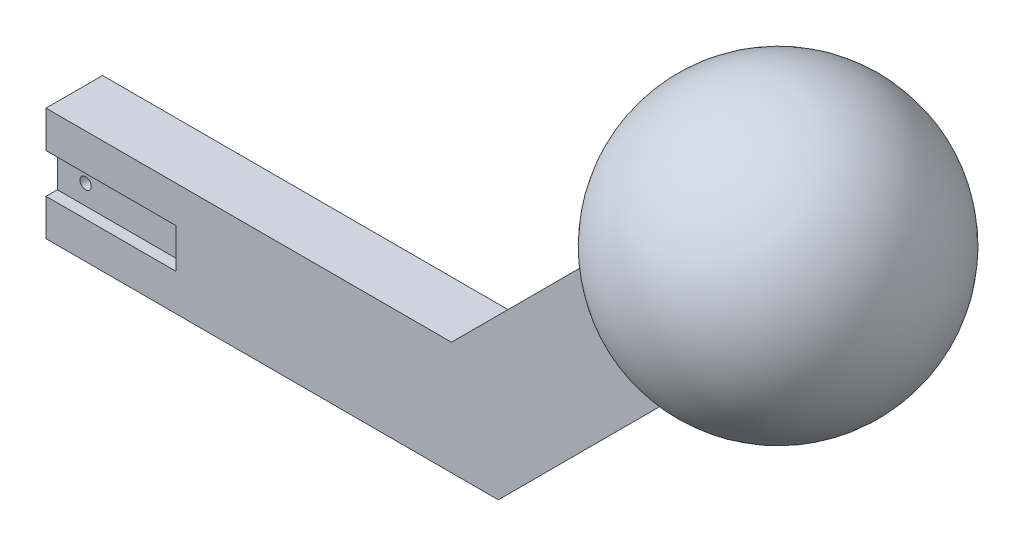
ISO-10303-21;
HEADER;
FILE_DESCRIPTION(('STEP AP214'),'2;1');
FILE_NAME('part.step','',(''),(''),'','','');
FILE_SCHEMA(('AUTOMOTIVE_DESIGN { 1 0 10303 214 1 1 1 1 }'));
ENDSEC;
DATA;
#1=APPLICATION_CONTEXT('core data for automotive mechanical design processes');
#2=APPLICATION_PROTOCOL_DEFINITION('international standard','automotive_design',2000,#1);
#3=PRODUCT_CONTEXT('',#1,'mechanical');
#4=PRODUCT('Part','Part','',(#3));
#5=PRODUCT_RELATED_PRODUCT_CATEGORY('part','',(#4));
#6=PRODUCT_DEFINITION_FORMATION('','',#4);
#7=PRODUCT_DEFINITION_CONTEXT('part definition',#1,'design');
#8=PRODUCT_DEFINITION('design','',#6,#7);
#9=PRODUCT_DEFINITION_SHAPE('','',#8);
#10=(LENGTH_UNIT() NAMED_UNIT(*) SI_UNIT(.MILLI.,.METRE.));
#11=(NAMED_UNIT(*) PLANE_ANGLE_UNIT() SI_UNIT($,.RADIAN.));
#12=(NAMED_UNIT(*) SI_UNIT($,.STERADIAN.) SOLID_ANGLE_UNIT());
#13=UNCERTAINTY_MEASURE_WITH_UNIT(LENGTH_MEASURE(1.E-05),#10,'distance_accuracy_value','');
#14=(GEOMETRIC_REPRESENTATION_CONTEXT(3) GLOBAL_UNCERTAINTY_ASSIGNED_CONTEXT((#13)) GLOBAL_UNIT_ASSIGNED_CONTEXT((#10,
#11,#12)) REPRESENTATION_CONTEXT('',''));
#15=CARTESIAN_POINT('',(0.,0.,0.));
#16=DIRECTION('',(0.,0.,1.));
#17=DIRECTION('',(1.,0.,0.));
#18=AXIS2_PLACEMENT_3D('',#15,#16,#17);
#19=CARTESIAN_POINT('',(5.,10.,10.));
#20=DIRECTION('',(0.,0.,-1.));
#21=DIRECTION('',(-1.,0.,0.));
#22=AXIS2_PLACEMENT_3D('',#19,#20,#21);
#23=CYLINDRICAL_SURFACE('',#22,1.);
#24=CARTESIAN_POINT('',(5.,10.,0.));
#25=DIRECTION('',(0.,0.,1.));
#26=DIRECTION('',(1.,0.,0.));
#27=AXIS2_PLACEMENT_3D('',#24,#25,#26);
#28=CIRCLE('',#27,1.);
#29=CARTESIAN_POINT('',(6.,10.,0.));
#30=VERTEX_POINT('',#29);
#31=EDGE_CURVE('E169',#30,#30,#28,.T.);
#32=ORIENTED_EDGE('',*,*,#31,.F.);
#33=EDGE_LOOP('',(#32));
#34=FACE_BOUND('',#33,.T.);
#35=CARTESIAN_POINT('',(5.,10.,8.));
#36=DIRECTION('',(0.,0.,1.));
#37=DIRECTION('',(1.,0.,0.));
#38=AXIS2_PLACEMENT_3D('',#35,#36,#37);
#39=CIRCLE('',#38,1.);
#40=CARTESIAN_POINT('',(6.,10.,8.));
#41=VERTEX_POINT('',#40);
#42=EDGE_CURVE('E41',#41,#41,#39,.T.);
#43=ORIENTED_EDGE('',*,*,#42,.T.);
#44=EDGE_LOOP('',(#43));
#45=FACE_BOUND('',#44,.T.);
#46=ADVANCED_FACE('F37',(#34,#45),#23,.F.);
#47=CARTESIAN_POINT('',(115.355339059327,35.3553390593274,10.));
#48=DIRECTION('',(-0.707106781186546,-0.707106781186549,0.));
#49=DIRECTION('',(0.707106781186549,-0.707106781186546,0.));
#50=AXIS2_PLACEMENT_3D('',#47,#48,#49);
#51=PLANE('',#50);
#52=DIRECTION('',(-0.707106781186549,0.707106781186546,0.));
#53=VECTOR('',#52,1.);
#54=CARTESIAN_POINT('',(115.355339059327,35.3553390593274,10.));
#55=LINE('',#54,#53);
#56=CARTESIAN_POINT('',(102.160546890504,48.5501312281508,10.));
#57=VERTEX_POINT('',#56);
#58=CARTESIAN_POINT('',(101.213203435596,49.4974746830584,10.));
#59=VERTEX_POINT('',#58);
#60=EDGE_CURVE('E180',#57,#59,#55,.T.);
#61=ORIENTED_EDGE('',*,*,#60,.F.);
#62=CARTESIAN_POINT('',(108.284271247462,42.4264068711929,5.));
#63=DIRECTION('',(-0.707106781186546,-0.707106781186549,0.));
#64=DIRECTION('',(0.707106781186549,-0.707106781186546,0.));
#65=AXIS2_PLACEMENT_3D('',#62,#63,#64);
#66=CIRCLE('',#65,10.);
#67=CARTESIAN_POINT('',(101.213203435596,49.4974746830584,5.));
#68=VERTEX_POINT('',#67);
#69=EDGE_CURVE('E263',#57,#68,#66,.T.);
#70=ORIENTED_EDGE('',*,*,#69,.T.);
#71=DIRECTION('',(0.,0.,-1.));
#72=VECTOR('',#71,1.);
#73=CARTESIAN_POINT('',(101.213203435596,49.4974746830584,10.));
#74=LINE('',#73,#72);
#75=EDGE_CURVE('E210',#59,#68,#74,.T.);
#76=ORIENTED_EDGE('',*,*,#75,.F.);
#77=EDGE_LOOP('',(#61,#70,#76));
#78=FACE_BOUND('',#77,.T.);
#79=ADVANCED_FACE('F285',(#78),#51,.F.);
#80=CARTESIAN_POINT('',(101.213203435596,49.4974746830584,0.));
#81=VERTEX_POINT('',#80);
#82=EDGE_CURVE('E209',#68,#81,#74,.T.);
#83=ORIENTED_EDGE('',*,*,#82,.F.);
#84=CARTESIAN_POINT('',(102.160546890504,48.5501312281508,0.));
#85=VERTEX_POINT('',#84);
#86=EDGE_CURVE('E260',#68,#85,#66,.T.);
#87=ORIENTED_EDGE('',*,*,#86,.T.);
#88=DIRECTION('',(-0.707106781186549,0.707106781186546,0.));
#89=VECTOR('',#88,1.);
#90=CARTESIAN_POINT('',(115.355339059327,35.3553390593274,0.));
#91=LINE('',#90,#89);
#92=EDGE_CURVE('E196',#85,#81,#91,.T.);
#93=ORIENTED_EDGE('',*,*,#92,.T.);
#94=EDGE_LOOP('',(#83,#87,#93));
#95=FACE_BOUND('',#94,.T.);
#96=ADVANCED_FACE('F259',(#95),#51,.F.);
#97=DIRECTION('',(0.,0.,-1.));
#98=VECTOR('',#97,1.);
#99=CARTESIAN_POINT('',(115.355339059327,35.3553390593274,10.));
#100=LINE('',#99,#98);
#101=CARTESIAN_POINT('',(115.355339059327,35.3553390593274,10.));
#102=VERTEX_POINT('',#101);
#103=CARTESIAN_POINT('',(115.355339059327,35.3553390593274,5.));
#104=VERTEX_POINT('',#103);
#105=EDGE_CURVE('E214',#102,#104,#100,.T.);
#106=ORIENTED_EDGE('',*,*,#105,.T.);
#107=CARTESIAN_POINT('',(114.40799560442,36.302682514235,10.));
#108=VERTEX_POINT('',#107);
#109=EDGE_CURVE('E61',#104,#108,#66,.T.);
#110=ORIENTED_EDGE('',*,*,#109,.T.);
#111=EDGE_CURVE('E181',#102,#108,#55,.T.);
#112=ORIENTED_EDGE('',*,*,#111,.F.);
#113=EDGE_LOOP('',(#106,#110,#112));
#114=FACE_BOUND('',#113,.T.);
#115=ADVANCED_FACE('F237',(#114),#51,.F.);
#116=CARTESIAN_POINT('',(0.,0.,10.));
#117=DIRECTION('',(0.,0.,1.));
#118=DIRECTION('',(1.,0.,0.));
#119=AXIS2_PLACEMENT_3D('',#116,#117,#118);
#120=PLANE('',#119);
#121=DIRECTION('',(-1.,0.,0.));
#122=VECTOR('',#121,1.);
#123=CARTESIAN_POINT('',(23.,13.5,10.));
#124=LINE('',#123,#122);
#125=CARTESIAN_POINT('',(23.,13.5,10.));
#126=VERTEX_POINT('',#125);
#127=CARTESIAN_POINT('',(0.,13.5,10.));
#128=VERTEX_POINT('',#127);
#129=EDGE_CURVE('E150',#126,#128,#124,.T.);
#130=ORIENTED_EDGE('',*,*,#129,.F.);
#131=DIRECTION('',(0.,1.,0.));
#132=VECTOR('',#131,1.);
#133=CARTESIAN_POINT('',(23.,6.5,10.));
#134=LINE('',#133,#132);
#135=CARTESIAN_POINT('',(23.,6.5,10.));
#136=VERTEX_POINT('',#135);
#137=EDGE_CURVE('E274',#136,#126,#134,.T.);
#138=ORIENTED_EDGE('',*,*,#137,.F.);
#139=DIRECTION('',(1.,0.,0.));
#140=VECTOR('',#139,1.);
#141=CARTESIAN_POINT('',(0.,6.5,10.));
#142=LINE('',#141,#140);
#143=CARTESIAN_POINT('',(0.,6.5,10.));
#144=VERTEX_POINT('',#143);
#145=EDGE_CURVE('E277',#144,#136,#142,.T.);
#146=ORIENTED_EDGE('',*,*,#145,.F.);
#147=DIRECTION('',(0.,-1.,0.));
#148=VECTOR('',#147,1.);
#149=CARTESIAN_POINT('',(0.,20.,10.));
#150=LINE('',#149,#148);
#151=CARTESIAN_POINT('',(0.,0.,10.));
#152=VERTEX_POINT('',#151);
#153=EDGE_CURVE('E154',#144,#152,#150,.T.);
#154=ORIENTED_EDGE('',*,*,#153,.T.);
#155=DIRECTION('',(1.,0.,0.));
#156=VECTOR('',#155,1.);
#157=CARTESIAN_POINT('',(0.,0.,10.));
#158=LINE('',#157,#156);
#159=CARTESIAN_POINT('',(80.,0.,10.));
#160=VERTEX_POINT('',#159);
#161=EDGE_CURVE('E176',#152,#160,#158,.T.);
#162=ORIENTED_EDGE('',*,*,#161,.T.);
#163=DIRECTION('',(0.707106781186546,0.707106781186549,0.));
#164=VECTOR('',#163,1.);
#165=CARTESIAN_POINT('',(80.,0.,10.));
#166=LINE('',#165,#164);
#167=EDGE_CURVE('E178',#160,#102,#166,.T.);
#168=ORIENTED_EDGE('',*,*,#167,.T.);
#169=ORIENTED_EDGE('',*,*,#111,.T.);
#170=DIRECTION('',(0.707106781186549,-0.707106781186546,0.));
#171=VECTOR('',#170,1.);
#172=CARTESIAN_POINT('',(75.3553390593271,75.3553390593275,10.));
#173=LINE('',#172,#171);
#174=EDGE_CURVE('E167',#57,#108,#173,.T.);
#175=ORIENTED_EDGE('',*,*,#174,.F.);
#176=ORIENTED_EDGE('',*,*,#60,.T.);
#177=DIRECTION('',(-0.707106781186546,-0.707106781186549,0.));
#178=VECTOR('',#177,1.);
#179=CARTESIAN_POINT('',(101.213203435596,49.4974746830584,10.));
#180=LINE('',#179,#178);
#181=CARTESIAN_POINT('',(71.7157287525381,20.,10.));
#182=VERTEX_POINT('',#181);
#183=EDGE_CURVE('E184',#59,#182,#180,.T.);
#184=ORIENTED_EDGE('',*,*,#183,.T.);
#185=DIRECTION('',(-1.,0.,0.));
#186=VECTOR('',#185,1.);
#187=CARTESIAN_POINT('',(71.7157287525381,20.,10.));
#188=LINE('',#187,#186);
#189=CARTESIAN_POINT('',(0.,20.,10.));
#190=VERTEX_POINT('',#189);
#191=EDGE_CURVE('E186',#182,#190,#188,.T.);
#192=ORIENTED_EDGE('',*,*,#191,.T.);
#193=EDGE_CURVE('E173',#190,#128,#150,.T.);
#194=ORIENTED_EDGE('',*,*,#193,.T.);
#195=EDGE_LOOP('',(#130,#138,#146,#154,#162,#168,#169,#175,#176,#184,#192,#194));
#196=FACE_BOUND('',#195,.T.);
#197=ADVANCED_FACE('F241',(#196),#120,.T.);
#198=CARTESIAN_POINT('',(0.,0.,0.));
#199=DIRECTION('',(0.,0.,1.));
#200=DIRECTION('',(1.,0.,0.));
#201=AXIS2_PLACEMENT_3D('',#198,#199,#200);
#202=PLANE('',#201);
#203=DIRECTION('',(0.,-1.,0.));
#204=VECTOR('',#203,1.);
#205=CARTESIAN_POINT('',(0.,20.,0.));
#206=LINE('',#205,#204);
#207=CARTESIAN_POINT('',(0.,20.,0.));
#208=VERTEX_POINT('',#207);
#209=CARTESIAN_POINT('',(0.,0.,0.));
#210=VERTEX_POINT('',#209);
#211=EDGE_CURVE('E172',#208,#210,#206,.T.);
#212=ORIENTED_EDGE('',*,*,#211,.F.);
#213=DIRECTION('',(-1.,0.,0.));
#214=VECTOR('',#213,1.);
#215=CARTESIAN_POINT('',(71.7157287525381,20.,0.));
#216=LINE('',#215,#214);
#217=CARTESIAN_POINT('',(71.7157287525381,20.,0.));
#218=VERTEX_POINT('',#217);
#219=EDGE_CURVE('E202',#218,#208,#216,.T.);
#220=ORIENTED_EDGE('',*,*,#219,.F.);
#221=DIRECTION('',(-0.707106781186546,-0.707106781186549,0.));
#222=VECTOR('',#221,1.);
#223=CARTESIAN_POINT('',(101.213203435596,49.4974746830584,0.));
#224=LINE('',#223,#222);
#225=EDGE_CURVE('E200',#81,#218,#224,.T.);
#226=ORIENTED_EDGE('',*,*,#225,.F.);
#227=ORIENTED_EDGE('',*,*,#92,.F.);
#228=DIRECTION('',(0.707106781186549,-0.707106781186546,0.));
#229=VECTOR('',#228,1.);
#230=CARTESIAN_POINT('',(75.3553390593271,75.3553390593275,0.));
#231=LINE('',#230,#229);
#232=CARTESIAN_POINT('',(114.40799560442,36.302682514235,0.));
#233=VERTEX_POINT('',#232);
#234=EDGE_CURVE('E162',#85,#233,#231,.T.);
#235=ORIENTED_EDGE('',*,*,#234,.T.);
#236=CARTESIAN_POINT('',(115.355339059327,35.3553390593274,0.));
#237=VERTEX_POINT('',#236);
#238=EDGE_CURVE('E197',#237,#233,#91,.T.);
#239=ORIENTED_EDGE('',*,*,#238,.F.);
#240=DIRECTION('',(0.707106781186546,0.707106781186549,0.));
#241=VECTOR('',#240,1.);
#242=CARTESIAN_POINT('',(80.,0.,0.));
#243=LINE('',#242,#241);
#244=CARTESIAN_POINT('',(80.,0.,0.));
#245=VERTEX_POINT('',#244);
#246=EDGE_CURVE('E193',#245,#237,#243,.T.);
#247=ORIENTED_EDGE('',*,*,#246,.F.);
#248=DIRECTION('',(1.,0.,0.));
#249=VECTOR('',#248,1.);
#250=CARTESIAN_POINT('',(0.,0.,0.));
#251=LINE('',#250,#249);
#252=EDGE_CURVE('E191',#210,#245,#251,.T.);
#253=ORIENTED_EDGE('',*,*,#252,.F.);
#254=EDGE_LOOP('',(#212,#220,#226,#227,#235,#239,#247,#253));
#255=FACE_BOUND('',#254,.T.);
#256=ORIENTED_EDGE('',*,*,#31,.T.);
#257=EDGE_LOOP('',(#256));
#258=FACE_BOUND('',#257,.T.);
#259=ADVANCED_FACE('F230',(#255,#258),#202,.F.);
#260=CARTESIAN_POINT('',(0.,20.,10.));
#261=DIRECTION('',(1.,0.,0.));
#262=DIRECTION('',(0.,1.,0.));
#263=AXIS2_PLACEMENT_3D('',#260,#261,#262);
#264=PLANE('',#263);
#265=DIRECTION('',(0.,-1.,0.));
#266=VECTOR('',#265,1.);
#267=CARTESIAN_POINT('',(0.,13.5,8.));
#268=LINE('',#267,#266);
#269=CARTESIAN_POINT('',(0.,13.5,8.));
#270=VERTEX_POINT('',#269);
#271=CARTESIAN_POINT('',(0.,6.5,8.));
#272=VERTEX_POINT('',#271);
#273=EDGE_CURVE('E144',#270,#272,#268,.T.);
#274=ORIENTED_EDGE('',*,*,#273,.F.);
#275=DIRECTION('',(0.,0.,1.));
#276=VECTOR('',#275,1.);
#277=CARTESIAN_POINT('',(0.,13.5,8.));
#278=LINE('',#277,#276);
#279=EDGE_CURVE('E268',#270,#128,#278,.T.);
#280=ORIENTED_EDGE('',*,*,#279,.T.);
#281=ORIENTED_EDGE('',*,*,#193,.F.);
#282=DIRECTION('',(0.,0.,-1.));
#283=VECTOR('',#282,1.);
#284=CARTESIAN_POINT('',(0.,20.,10.));
#285=LINE('',#284,#283);
#286=EDGE_CURVE('E188',#190,#208,#285,.T.);
#287=ORIENTED_EDGE('',*,*,#286,.T.);
#288=ORIENTED_EDGE('',*,*,#211,.T.);
#289=DIRECTION('',(0.,0.,-1.));
#290=VECTOR('',#289,1.);
#291=CARTESIAN_POINT('',(0.,0.,10.));
#292=LINE('',#291,#290);
#293=EDGE_CURVE('E11',#152,#210,#292,.T.);
#294=ORIENTED_EDGE('',*,*,#293,.F.);
#295=ORIENTED_EDGE('',*,*,#153,.F.);
#296=DIRECTION('',(0.,0.,1.));
#297=VECTOR('',#296,1.);
#298=CARTESIAN_POINT('',(0.,6.5,8.));
#299=LINE('',#298,#297);
#300=EDGE_CURVE('E139',#272,#144,#299,.T.);
#301=ORIENTED_EDGE('',*,*,#300,.F.);
#302=EDGE_LOOP('',(#274,#280,#281,#287,#288,#294,#295,#301));
#303=FACE_BOUND('',#302,.T.);
#304=ADVANCED_FACE('F39',(#303),#264,.F.);
#305=CARTESIAN_POINT('',(0.,0.,10.));
#306=DIRECTION('',(0.,1.,0.));
#307=DIRECTION('',(0.,0.,1.));
#308=AXIS2_PLACEMENT_3D('',#305,#306,#307);
#309=PLANE('',#308);
#310=ORIENTED_EDGE('',*,*,#252,.T.);
#311=DIRECTION('',(0.,0.,-1.));
#312=VECTOR('',#311,1.);
#313=CARTESIAN_POINT('',(80.,0.,10.));
#314=LINE('',#313,#312);
#315=EDGE_CURVE('E46',#160,#245,#314,.T.);
#316=ORIENTED_EDGE('',*,*,#315,.F.);
#317=ORIENTED_EDGE('',*,*,#161,.F.);
#318=ORIENTED_EDGE('',*,*,#293,.T.);
#319=EDGE_LOOP('',(#310,#316,#317,#318));
#320=FACE_BOUND('',#319,.T.);
#321=ADVANCED_FACE('F242',(#320),#309,.F.);
#322=CARTESIAN_POINT('',(80.,0.,10.));
#323=DIRECTION('',(-0.707106781186549,0.707106781186546,0.));
#324=DIRECTION('',(-0.707106781186546,-0.707106781186549,0.));
#325=AXIS2_PLACEMENT_3D('',#322,#323,#324);
#326=PLANE('',#325);
#327=ORIENTED_EDGE('',*,*,#246,.T.);
#328=EDGE_CURVE('E213',#104,#237,#100,.T.);
#329=ORIENTED_EDGE('',*,*,#328,.F.);
#330=ORIENTED_EDGE('',*,*,#105,.F.);
#331=ORIENTED_EDGE('',*,*,#167,.F.);
#332=ORIENTED_EDGE('',*,*,#315,.T.);
#333=EDGE_LOOP('',(#327,#329,#330,#331,#332));
#334=FACE_BOUND('',#333,.T.);
#335=ADVANCED_FACE('F222',(#334),#326,.F.);
#336=ORIENTED_EDGE('',*,*,#238,.T.);
#337=EDGE_CURVE('E164',#233,#104,#66,.T.);
#338=ORIENTED_EDGE('',*,*,#337,.T.);
#339=ORIENTED_EDGE('',*,*,#328,.T.);
#340=EDGE_LOOP('',(#336,#338,#339));
#341=FACE_BOUND('',#340,.T.);
#342=ADVANCED_FACE('F234',(#341),#51,.F.);
#343=CARTESIAN_POINT('',(101.213203435596,49.4974746830584,10.));
#344=DIRECTION('',(0.707106781186549,-0.707106781186546,0.));
#345=DIRECTION('',(0.707106781186546,0.707106781186549,0.));
#346=AXIS2_PLACEMENT_3D('',#343,#344,#345);
#347=PLANE('',#346);
#348=ORIENTED_EDGE('',*,*,#225,.T.);
#349=DIRECTION('',(0.,0.,-1.));
#350=VECTOR('',#349,1.);
#351=CARTESIAN_POINT('',(71.7157287525381,20.,10.));
#352=LINE('',#351,#350);
#353=EDGE_CURVE('E206',#182,#218,#352,.T.);
#354=ORIENTED_EDGE('',*,*,#353,.F.);
#355=ORIENTED_EDGE('',*,*,#183,.F.);
#356=ORIENTED_EDGE('',*,*,#75,.T.);
#357=ORIENTED_EDGE('',*,*,#82,.T.);
#358=EDGE_LOOP('',(#348,#354,#355,#356,#357));
#359=FACE_BOUND('',#358,.T.);
#360=ADVANCED_FACE('F253',(#359),#347,.F.);
#361=CARTESIAN_POINT('',(71.7157287525381,20.,10.));
#362=DIRECTION('',(0.,-1.,0.));
#363=DIRECTION('',(1.,0.,0.));
#364=AXIS2_PLACEMENT_3D('',#361,#362,#363);
#365=PLANE('',#364);
#366=ORIENTED_EDGE('',*,*,#219,.T.);
#367=ORIENTED_EDGE('',*,*,#286,.F.);
#368=ORIENTED_EDGE('',*,*,#191,.F.);
#369=ORIENTED_EDGE('',*,*,#353,.T.);
#370=EDGE_LOOP('',(#366,#367,#368,#369));
#371=FACE_BOUND('',#370,.T.);
#372=ADVANCED_FACE('F248',(#371),#365,.F.);
#373=CARTESIAN_POINT('',(108.284271247462,42.4264068711929,5.));
#374=DIRECTION('',(-0.707106781186546,-0.707106781186549,0.));
#375=DIRECTION('',(0.707106781186549,-0.707106781186546,0.));
#376=AXIS2_PLACEMENT_3D('',#373,#374,#375);
#377=PLANE('',#376);
#378=ORIENTED_EDGE('',*,*,#234,.F.);
#379=EDGE_CURVE('E264',#85,#233,#66,.T.);
#380=ORIENTED_EDGE('',*,*,#379,.T.);
#381=EDGE_LOOP('',(#378,#380));
#382=FACE_BOUND('',#381,.T.);
#383=ADVANCED_FACE('F291',(#382),#377,.T.);
#384=EDGE_CURVE('E163',#108,#57,#66,.T.);
#385=ORIENTED_EDGE('',*,*,#384,.T.);
#386=ORIENTED_EDGE('',*,*,#174,.T.);
#387=EDGE_LOOP('',(#385,#386));
#388=FACE_BOUND('',#387,.T.);
#389=ADVANCED_FACE('F289',(#388),#377,.T.);
#390=CARTESIAN_POINT('',(124.486122993481,58.6282586172126,5.));
#391=DIRECTION('',(-0.707106781186546,-0.707106781186549,0.));
#392=DIRECTION('',(0.707106781186549,-0.707106781186546,0.));
#393=AXIS2_PLACEMENT_3D('',#390,#391,#392);
#394=SPHERICAL_SURFACE('',#393,25.);
#395=ORIENTED_EDGE('',*,*,#109,.F.);
#396=ORIENTED_EDGE('',*,*,#337,.F.);
#397=ORIENTED_EDGE('',*,*,#379,.F.);
#398=ORIENTED_EDGE('',*,*,#86,.F.);
#399=ORIENTED_EDGE('',*,*,#69,.F.);
#400=ORIENTED_EDGE('',*,*,#384,.F.);
#401=EDGE_LOOP('',(#395,#396,#397,#398,#399,#400));
#402=FACE_BOUND('',#401,.T.);
#403=ADVANCED_FACE('F287',(#402),#394,.T.);
#404=CARTESIAN_POINT('',(23.,13.5,8.));
#405=DIRECTION('',(0.,1.,0.));
#406=DIRECTION('',(-1.,0.,0.));
#407=AXIS2_PLACEMENT_3D('',#404,#405,#406);
#408=PLANE('',#407);
#409=ORIENTED_EDGE('',*,*,#129,.T.);
#410=ORIENTED_EDGE('',*,*,#279,.F.);
#411=DIRECTION('',(-1.,0.,0.));
#412=VECTOR('',#411,1.);
#413=CARTESIAN_POINT('',(23.,13.5,8.));
#414=LINE('',#413,#412);
#415=CARTESIAN_POINT('',(23.,13.5,8.));
#416=VERTEX_POINT('',#415);
#417=EDGE_CURVE('E53',#416,#270,#414,.T.);
#418=ORIENTED_EDGE('',*,*,#417,.F.);
#419=DIRECTION('',(0.,0.,1.));
#420=VECTOR('',#419,1.);
#421=CARTESIAN_POINT('',(23.,13.5,8.));
#422=LINE('',#421,#420);
#423=EDGE_CURVE('E156',#416,#126,#422,.T.);
#424=ORIENTED_EDGE('',*,*,#423,.T.);
#425=EDGE_LOOP('',(#409,#410,#418,#424));
#426=FACE_BOUND('',#425,.T.);
#427=ADVANCED_FACE('F281',(#426),#408,.F.);
#428=CARTESIAN_POINT('',(23.,6.5,8.));
#429=DIRECTION('',(1.,0.,0.));
#430=DIRECTION('',(0.,0.,-1.));
#431=AXIS2_PLACEMENT_3D('',#428,#429,#430);
#432=PLANE('',#431);
#433=ORIENTED_EDGE('',*,*,#137,.T.);
#434=ORIENTED_EDGE('',*,*,#423,.F.);
#435=DIRECTION('',(0.,1.,0.));
#436=VECTOR('',#435,1.);
#437=CARTESIAN_POINT('',(23.,6.5,8.));
#438=LINE('',#437,#436);
#439=CARTESIAN_POINT('',(23.,6.5,8.));
#440=VERTEX_POINT('',#439);
#441=EDGE_CURVE('E143',#440,#416,#438,.T.);
#442=ORIENTED_EDGE('',*,*,#441,.F.);
#443=DIRECTION('',(0.,0.,1.));
#444=VECTOR('',#443,1.);
#445=CARTESIAN_POINT('',(23.,6.5,8.));
#446=LINE('',#445,#444);
#447=EDGE_CURVE('E141',#440,#136,#446,.T.);
#448=ORIENTED_EDGE('',*,*,#447,.T.);
#449=EDGE_LOOP('',(#433,#434,#442,#448));
#450=FACE_BOUND('',#449,.T.);
#451=ADVANCED_FACE('F403',(#450),#432,.F.);
#452=CARTESIAN_POINT('',(0.,6.5,8.));
#453=DIRECTION('',(0.,-1.,0.));
#454=DIRECTION('',(1.,0.,0.));
#455=AXIS2_PLACEMENT_3D('',#452,#453,#454);
#456=PLANE('',#455);
#457=ORIENTED_EDGE('',*,*,#145,.T.);
#458=ORIENTED_EDGE('',*,*,#447,.F.);
#459=DIRECTION('',(1.,0.,0.));
#460=VECTOR('',#459,1.);
#461=CARTESIAN_POINT('',(0.,6.5,8.));
#462=LINE('',#461,#460);
#463=EDGE_CURVE('E135',#272,#440,#462,.T.);
#464=ORIENTED_EDGE('',*,*,#463,.F.);
#465=ORIENTED_EDGE('',*,*,#300,.T.);
#466=EDGE_LOOP('',(#457,#458,#464,#465));
#467=FACE_BOUND('',#466,.T.);
#468=ADVANCED_FACE('F137',(#467),#456,.F.);
#469=CARTESIAN_POINT('',(0.,0.,8.));
#470=DIRECTION('',(0.,0.,1.));
#471=DIRECTION('',(1.,0.,0.));
#472=AXIS2_PLACEMENT_3D('',#469,#470,#471);
#473=PLANE('',#472);
#474=ORIENTED_EDGE('',*,*,#42,.F.);
#475=EDGE_LOOP('',(#474));
#476=FACE_BOUND('',#475,.T.);
#477=ORIENTED_EDGE('',*,*,#273,.T.);
#478=ORIENTED_EDGE('',*,*,#463,.T.);
#479=ORIENTED_EDGE('',*,*,#441,.T.);
#480=ORIENTED_EDGE('',*,*,#417,.T.);
#481=EDGE_LOOP('',(#477,#478,#479,#480));
#482=FACE_BOUND('',#481,.T.);
#483=ADVANCED_FACE('F147',(#476,#482),#473,.T.);
#484=CLOSED_SHELL('',(#46,#79,#96,#115,#197,#259,#304,#321,#335,#342,#360,#372,#383,#389,#403,
#427,#451,#468,#483));
#485=MANIFOLD_SOLID_BREP('B2',#484);
#486=ADVANCED_BREP_SHAPE_REPRESENTATION('',(#18,#485),#14);
#487=SHAPE_DEFINITION_REPRESENTATION(#9,#486);
ENDSEC;
END-ISO-10303-21;
